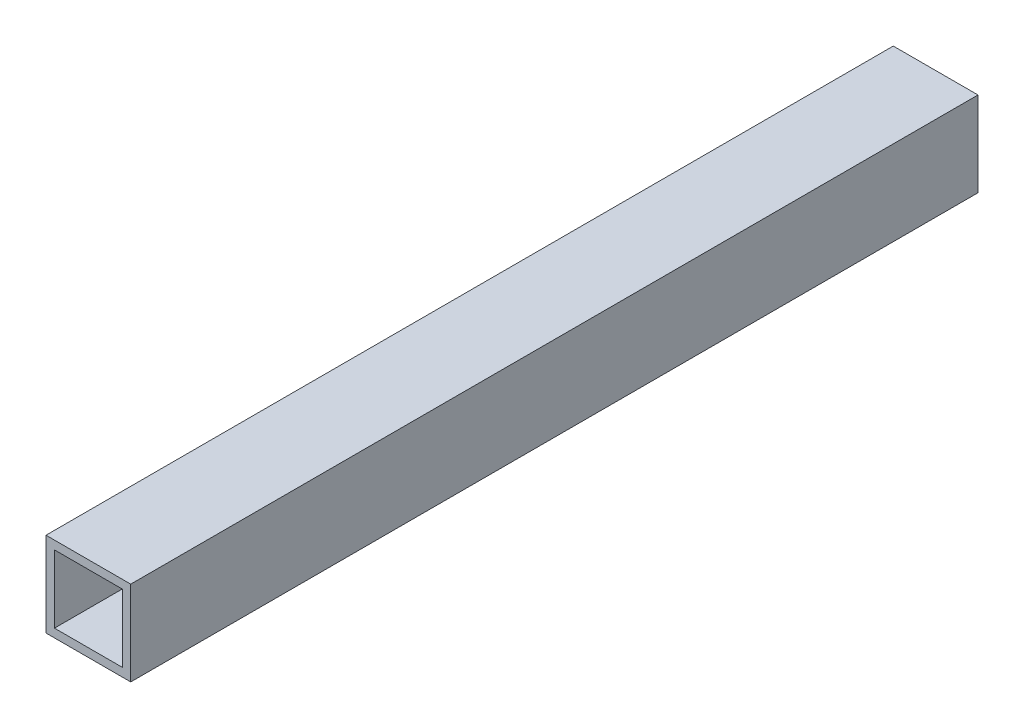
ISO-10303-21;
HEADER;
FILE_DESCRIPTION(('STEP AP214'),'2;1');
FILE_NAME('part.step','',(''),(''),'','','');
FILE_SCHEMA(('AUTOMOTIVE_DESIGN { 1 0 10303 214 1 1 1 1 }'));
ENDSEC;
DATA;
#1=APPLICATION_CONTEXT('core data for automotive mechanical design processes');
#2=APPLICATION_PROTOCOL_DEFINITION('international standard','automotive_design',2000,#1);
#3=PRODUCT_CONTEXT('',#1,'mechanical');
#4=PRODUCT('Part','Part','',(#3));
#5=PRODUCT_RELATED_PRODUCT_CATEGORY('part','',(#4));
#6=PRODUCT_DEFINITION_FORMATION('','',#4);
#7=PRODUCT_DEFINITION_CONTEXT('part definition',#1,'design');
#8=PRODUCT_DEFINITION('design','',#6,#7);
#9=PRODUCT_DEFINITION_SHAPE('','',#8);
#10=(LENGTH_UNIT() NAMED_UNIT(*) SI_UNIT(.MILLI.,.METRE.));
#11=(NAMED_UNIT(*) PLANE_ANGLE_UNIT() SI_UNIT($,.RADIAN.));
#12=(NAMED_UNIT(*) SI_UNIT($,.STERADIAN.) SOLID_ANGLE_UNIT());
#13=UNCERTAINTY_MEASURE_WITH_UNIT(LENGTH_MEASURE(1.E-05),#10,'distance_accuracy_value','');
#14=(GEOMETRIC_REPRESENTATION_CONTEXT(3) GLOBAL_UNCERTAINTY_ASSIGNED_CONTEXT((#13)) GLOBAL_UNIT_ASSIGNED_CONTEXT((#10,
#11,#12)) REPRESENTATION_CONTEXT('',''));
#15=CARTESIAN_POINT('',(0.,0.,0.));
#16=DIRECTION('',(0.,0.,1.));
#17=DIRECTION('',(1.,0.,0.));
#18=AXIS2_PLACEMENT_3D('',#15,#16,#17);
#19=CARTESIAN_POINT('',(0.,0.,500.));
#20=DIRECTION('',(0.,0.,1.));
#21=DIRECTION('',(1.,0.,0.));
#22=AXIS2_PLACEMENT_3D('',#19,#20,#21);
#23=PLANE('',#22);
#24=DIRECTION('',(0.,-1.,0.));
#25=VECTOR('',#24,1.);
#26=CARTESIAN_POINT('',(-25.,25.,500.));
#27=LINE('',#26,#25);
#28=CARTESIAN_POINT('',(-25.,25.,500.));
#29=VERTEX_POINT('',#28);
#30=CARTESIAN_POINT('',(-25.,-25.,500.));
#31=VERTEX_POINT('',#30);
#32=EDGE_CURVE('E137',#29,#31,#27,.T.);
#33=ORIENTED_EDGE('',*,*,#32,.T.);
#34=DIRECTION('',(1.,0.,0.));
#35=VECTOR('',#34,1.);
#36=CARTESIAN_POINT('',(-25.,-25.,500.));
#37=LINE('',#36,#35);
#38=CARTESIAN_POINT('',(25.,-25.,500.));
#39=VERTEX_POINT('',#38);
#40=EDGE_CURVE('E140',#31,#39,#37,.T.);
#41=ORIENTED_EDGE('',*,*,#40,.T.);
#42=DIRECTION('',(0.,1.,0.));
#43=VECTOR('',#42,1.);
#44=CARTESIAN_POINT('',(25.,25.,500.));
#45=LINE('',#44,#43);
#46=CARTESIAN_POINT('',(25.,25.,500.));
#47=VERTEX_POINT('',#46);
#48=EDGE_CURVE('E143',#39,#47,#45,.T.);
#49=ORIENTED_EDGE('',*,*,#48,.T.);
#50=DIRECTION('',(-1.,0.,0.));
#51=VECTOR('',#50,1.);
#52=CARTESIAN_POINT('',(-25.,25.,500.));
#53=LINE('',#52,#51);
#54=EDGE_CURVE('E145',#47,#29,#53,.T.);
#55=ORIENTED_EDGE('',*,*,#54,.T.);
#56=EDGE_LOOP('',(#33,#41,#49,#55));
#57=FACE_BOUND('',#56,.T.);
#58=DIRECTION('',(0.,-1.,0.));
#59=VECTOR('',#58,1.);
#60=CARTESIAN_POINT('',(-20.,20.,500.));
#61=LINE('',#60,#59);
#62=CARTESIAN_POINT('',(-20.,20.,500.));
#63=VERTEX_POINT('',#62);
#64=CARTESIAN_POINT('',(-20.,-20.,500.));
#65=VERTEX_POINT('',#64);
#66=EDGE_CURVE('E109',#63,#65,#61,.T.);
#67=ORIENTED_EDGE('',*,*,#66,.F.);
#68=DIRECTION('',(-1.,0.,0.));
#69=VECTOR('',#68,1.);
#70=CARTESIAN_POINT('',(-20.,20.,500.));
#71=LINE('',#70,#69);
#72=CARTESIAN_POINT('',(20.,20.,500.));
#73=VERTEX_POINT('',#72);
#74=EDGE_CURVE('E101',#73,#63,#71,.T.);
#75=ORIENTED_EDGE('',*,*,#74,.F.);
#76=DIRECTION('',(0.,1.,0.));
#77=VECTOR('',#76,1.);
#78=CARTESIAN_POINT('',(20.,20.,500.));
#79=LINE('',#78,#77);
#80=CARTESIAN_POINT('',(20.,-20.,500.));
#81=VERTEX_POINT('',#80);
#82=EDGE_CURVE('E123',#81,#73,#79,.T.);
#83=ORIENTED_EDGE('',*,*,#82,.F.);
#84=DIRECTION('',(1.,0.,0.));
#85=VECTOR('',#84,1.);
#86=CARTESIAN_POINT('',(-20.,-20.,500.));
#87=LINE('',#86,#85);
#88=EDGE_CURVE('E121',#65,#81,#87,.T.);
#89=ORIENTED_EDGE('',*,*,#88,.F.);
#90=EDGE_LOOP('',(#67,#75,#83,#89));
#91=FACE_BOUND('',#90,.T.);
#92=ADVANCED_FACE('F36',(#57,#91),#23,.T.);
#93=CARTESIAN_POINT('',(0.,0.,0.));
#94=DIRECTION('',(0.,0.,1.));
#95=DIRECTION('',(1.,0.,0.));
#96=AXIS2_PLACEMENT_3D('',#93,#94,#95);
#97=PLANE('',#96);
#98=DIRECTION('',(0.,-1.,0.));
#99=VECTOR('',#98,1.);
#100=CARTESIAN_POINT('',(-25.,25.,0.));
#101=LINE('',#100,#99);
#102=CARTESIAN_POINT('',(-25.,25.,0.));
#103=VERTEX_POINT('',#102);
#104=CARTESIAN_POINT('',(-25.,-25.,0.));
#105=VERTEX_POINT('',#104);
#106=EDGE_CURVE('E117',#103,#105,#101,.T.);
#107=ORIENTED_EDGE('',*,*,#106,.F.);
#108=DIRECTION('',(-1.,0.,0.));
#109=VECTOR('',#108,1.);
#110=CARTESIAN_POINT('',(-25.,25.,0.));
#111=LINE('',#110,#109);
#112=CARTESIAN_POINT('',(25.,25.,0.));
#113=VERTEX_POINT('',#112);
#114=EDGE_CURVE('E141',#113,#103,#111,.T.);
#115=ORIENTED_EDGE('',*,*,#114,.F.);
#116=DIRECTION('',(0.,1.,0.));
#117=VECTOR('',#116,1.);
#118=CARTESIAN_POINT('',(25.,25.,0.));
#119=LINE('',#118,#117);
#120=CARTESIAN_POINT('',(25.,-25.,0.));
#121=VERTEX_POINT('',#120);
#122=EDGE_CURVE('E152',#121,#113,#119,.T.);
#123=ORIENTED_EDGE('',*,*,#122,.F.);
#124=DIRECTION('',(1.,0.,0.));
#125=VECTOR('',#124,1.);
#126=CARTESIAN_POINT('',(-25.,-25.,0.));
#127=LINE('',#126,#125);
#128=EDGE_CURVE('E150',#105,#121,#127,.T.);
#129=ORIENTED_EDGE('',*,*,#128,.F.);
#130=EDGE_LOOP('',(#107,#115,#123,#129));
#131=FACE_BOUND('',#130,.T.);
#132=DIRECTION('',(-1.,0.,0.));
#133=VECTOR('',#132,1.);
#134=CARTESIAN_POINT('',(-20.,20.,0.));
#135=LINE('',#134,#133);
#136=CARTESIAN_POINT('',(20.,20.,0.));
#137=VERTEX_POINT('',#136);
#138=CARTESIAN_POINT('',(-20.,20.,0.));
#139=VERTEX_POINT('',#138);
#140=EDGE_CURVE('E59',#137,#139,#135,.T.);
#141=ORIENTED_EDGE('',*,*,#140,.T.);
#142=DIRECTION('',(0.,-1.,0.));
#143=VECTOR('',#142,1.);
#144=CARTESIAN_POINT('',(-20.,20.,0.));
#145=LINE('',#144,#143);
#146=CARTESIAN_POINT('',(-20.,-20.,0.));
#147=VERTEX_POINT('',#146);
#148=EDGE_CURVE('E116',#139,#147,#145,.T.);
#149=ORIENTED_EDGE('',*,*,#148,.T.);
#150=DIRECTION('',(1.,0.,0.));
#151=VECTOR('',#150,1.);
#152=CARTESIAN_POINT('',(-20.,-20.,0.));
#153=LINE('',#152,#151);
#154=CARTESIAN_POINT('',(20.,-20.,0.));
#155=VERTEX_POINT('',#154);
#156=EDGE_CURVE('E129',#147,#155,#153,.T.);
#157=ORIENTED_EDGE('',*,*,#156,.T.);
#158=DIRECTION('',(0.,1.,0.));
#159=VECTOR('',#158,1.);
#160=CARTESIAN_POINT('',(20.,20.,0.));
#161=LINE('',#160,#159);
#162=EDGE_CURVE('E110',#155,#137,#161,.T.);
#163=ORIENTED_EDGE('',*,*,#162,.T.);
#164=EDGE_LOOP('',(#141,#149,#157,#163));
#165=FACE_BOUND('',#164,.T.);
#166=ADVANCED_FACE('F170',(#131,#165),#97,.F.);
#167=CARTESIAN_POINT('',(-25.,25.,500.));
#168=DIRECTION('',(1.,0.,0.));
#169=DIRECTION('',(0.,1.,0.));
#170=AXIS2_PLACEMENT_3D('',#167,#168,#169);
#171=PLANE('',#170);
#172=ORIENTED_EDGE('',*,*,#106,.T.);
#173=DIRECTION('',(0.,0.,-1.));
#174=VECTOR('',#173,1.);
#175=CARTESIAN_POINT('',(-25.,-25.,500.));
#176=LINE('',#175,#174);
#177=EDGE_CURVE('E11',#31,#105,#176,.T.);
#178=ORIENTED_EDGE('',*,*,#177,.F.);
#179=ORIENTED_EDGE('',*,*,#32,.F.);
#180=DIRECTION('',(0.,0.,-1.));
#181=VECTOR('',#180,1.);
#182=CARTESIAN_POINT('',(-25.,25.,500.));
#183=LINE('',#182,#181);
#184=EDGE_CURVE('E147',#29,#103,#183,.T.);
#185=ORIENTED_EDGE('',*,*,#184,.T.);
#186=EDGE_LOOP('',(#172,#178,#179,#185));
#187=FACE_BOUND('',#186,.T.);
#188=ADVANCED_FACE('F38',(#187),#171,.F.);
#189=CARTESIAN_POINT('',(-25.,-25.,500.));
#190=DIRECTION('',(0.,1.,0.));
#191=DIRECTION('',(0.,0.,1.));
#192=AXIS2_PLACEMENT_3D('',#189,#190,#191);
#193=PLANE('',#192);
#194=ORIENTED_EDGE('',*,*,#128,.T.);
#195=DIRECTION('',(0.,0.,-1.));
#196=VECTOR('',#195,1.);
#197=CARTESIAN_POINT('',(25.,-25.,500.));
#198=LINE('',#197,#196);
#199=EDGE_CURVE('E44',#39,#121,#198,.T.);
#200=ORIENTED_EDGE('',*,*,#199,.F.);
#201=ORIENTED_EDGE('',*,*,#40,.F.);
#202=ORIENTED_EDGE('',*,*,#177,.T.);
#203=EDGE_LOOP('',(#194,#200,#201,#202));
#204=FACE_BOUND('',#203,.T.);
#205=ADVANCED_FACE('F180',(#204),#193,.F.);
#206=CARTESIAN_POINT('',(25.,25.,500.));
#207=DIRECTION('',(-1.,0.,0.));
#208=DIRECTION('',(0.,-1.,0.));
#209=AXIS2_PLACEMENT_3D('',#206,#207,#208);
#210=PLANE('',#209);
#211=ORIENTED_EDGE('',*,*,#122,.T.);
#212=DIRECTION('',(0.,0.,-1.));
#213=VECTOR('',#212,1.);
#214=CARTESIAN_POINT('',(25.,25.,500.));
#215=LINE('',#214,#213);
#216=EDGE_CURVE('E157',#47,#113,#215,.T.);
#217=ORIENTED_EDGE('',*,*,#216,.F.);
#218=ORIENTED_EDGE('',*,*,#48,.F.);
#219=ORIENTED_EDGE('',*,*,#199,.T.);
#220=EDGE_LOOP('',(#211,#217,#218,#219));
#221=FACE_BOUND('',#220,.T.);
#222=ADVANCED_FACE('F164',(#221),#210,.F.);
#223=CARTESIAN_POINT('',(-25.,25.,500.));
#224=DIRECTION('',(0.,-1.,0.));
#225=DIRECTION('',(0.,0.,-1.));
#226=AXIS2_PLACEMENT_3D('',#223,#224,#225);
#227=PLANE('',#226);
#228=ORIENTED_EDGE('',*,*,#114,.T.);
#229=ORIENTED_EDGE('',*,*,#184,.F.);
#230=ORIENTED_EDGE('',*,*,#54,.F.);
#231=ORIENTED_EDGE('',*,*,#216,.T.);
#232=EDGE_LOOP('',(#228,#229,#230,#231));
#233=FACE_BOUND('',#232,.T.);
#234=ADVANCED_FACE('F174',(#233),#227,.F.);
#235=CARTESIAN_POINT('',(-20.,20.,500.));
#236=DIRECTION('',(0.,-1.,0.));
#237=DIRECTION('',(0.,0.,-1.));
#238=AXIS2_PLACEMENT_3D('',#235,#236,#237);
#239=PLANE('',#238);
#240=ORIENTED_EDGE('',*,*,#140,.F.);
#241=DIRECTION('',(0.,0.,-1.));
#242=VECTOR('',#241,1.);
#243=CARTESIAN_POINT('',(20.,20.,500.));
#244=LINE('',#243,#242);
#245=EDGE_CURVE('E105',#73,#137,#244,.T.);
#246=ORIENTED_EDGE('',*,*,#245,.F.);
#247=ORIENTED_EDGE('',*,*,#74,.T.);
#248=DIRECTION('',(0.,0.,-1.));
#249=VECTOR('',#248,1.);
#250=CARTESIAN_POINT('',(-20.,20.,500.));
#251=LINE('',#250,#249);
#252=EDGE_CURVE('E104',#63,#139,#251,.T.);
#253=ORIENTED_EDGE('',*,*,#252,.T.);
#254=EDGE_LOOP('',(#240,#246,#247,#253));
#255=FACE_BOUND('',#254,.T.);
#256=ADVANCED_FACE('F103',(#255),#239,.T.);
#257=CARTESIAN_POINT('',(-20.,20.,500.));
#258=DIRECTION('',(1.,0.,0.));
#259=DIRECTION('',(0.,1.,0.));
#260=AXIS2_PLACEMENT_3D('',#257,#258,#259);
#261=PLANE('',#260);
#262=ORIENTED_EDGE('',*,*,#148,.F.);
#263=ORIENTED_EDGE('',*,*,#252,.F.);
#264=ORIENTED_EDGE('',*,*,#66,.T.);
#265=DIRECTION('',(0.,0.,-1.));
#266=VECTOR('',#265,1.);
#267=CARTESIAN_POINT('',(-20.,-20.,500.));
#268=LINE('',#267,#266);
#269=EDGE_CURVE('E118',#65,#147,#268,.T.);
#270=ORIENTED_EDGE('',*,*,#269,.T.);
#271=EDGE_LOOP('',(#262,#263,#264,#270));
#272=FACE_BOUND('',#271,.T.);
#273=ADVANCED_FACE('F113',(#272),#261,.T.);
#274=CARTESIAN_POINT('',(-20.,-20.,500.));
#275=DIRECTION('',(0.,1.,0.));
#276=DIRECTION('',(0.,0.,1.));
#277=AXIS2_PLACEMENT_3D('',#274,#275,#276);
#278=PLANE('',#277);
#279=ORIENTED_EDGE('',*,*,#156,.F.);
#280=ORIENTED_EDGE('',*,*,#269,.F.);
#281=ORIENTED_EDGE('',*,*,#88,.T.);
#282=DIRECTION('',(0.,0.,-1.));
#283=VECTOR('',#282,1.);
#284=CARTESIAN_POINT('',(20.,-20.,500.));
#285=LINE('',#284,#283);
#286=EDGE_CURVE('E51',#81,#155,#285,.T.);
#287=ORIENTED_EDGE('',*,*,#286,.T.);
#288=EDGE_LOOP('',(#279,#280,#281,#287));
#289=FACE_BOUND('',#288,.T.);
#290=ADVANCED_FACE('F203',(#289),#278,.T.);
#291=CARTESIAN_POINT('',(20.,20.,500.));
#292=DIRECTION('',(-1.,0.,0.));
#293=DIRECTION('',(0.,-1.,0.));
#294=AXIS2_PLACEMENT_3D('',#291,#292,#293);
#295=PLANE('',#294);
#296=ORIENTED_EDGE('',*,*,#162,.F.);
#297=ORIENTED_EDGE('',*,*,#286,.F.);
#298=ORIENTED_EDGE('',*,*,#82,.T.);
#299=ORIENTED_EDGE('',*,*,#245,.T.);
#300=EDGE_LOOP('',(#296,#297,#298,#299));
#301=FACE_BOUND('',#300,.T.);
#302=ADVANCED_FACE('F207',(#301),#295,.T.);
#303=CLOSED_SHELL('',(#92,#166,#188,#205,#222,#234,#256,#273,#290,#302));
#304=MANIFOLD_SOLID_BREP('B2',#303);
#305=ADVANCED_BREP_SHAPE_REPRESENTATION('',(#18,#304),#14);
#306=SHAPE_DEFINITION_REPRESENTATION(#9,#305);
ENDSEC;
END-ISO-10303-21;
